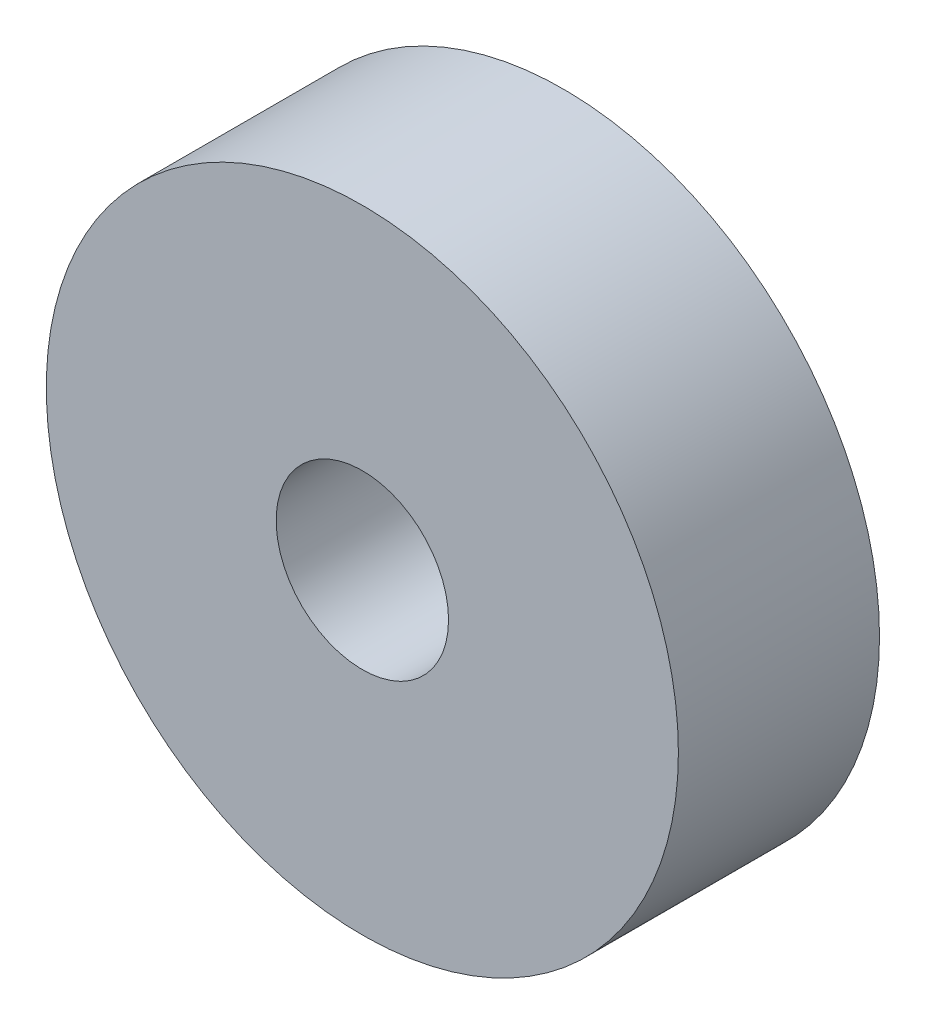
ISO-10303-21;
HEADER;
FILE_DESCRIPTION(('STEP AP214'),'2;1');
FILE_NAME('part.step','',(''),(''),'','','');
FILE_SCHEMA(('AUTOMOTIVE_DESIGN { 1 0 10303 214 1 1 1 1 }'));
ENDSEC;
DATA;
#1=APPLICATION_CONTEXT('core data for automotive mechanical design processes');
#2=APPLICATION_PROTOCOL_DEFINITION('international standard','automotive_design',2000,#1);
#3=PRODUCT_CONTEXT('',#1,'mechanical');
#4=PRODUCT('Part','Part','',(#3));
#5=PRODUCT_RELATED_PRODUCT_CATEGORY('part','',(#4));
#6=PRODUCT_DEFINITION_FORMATION('','',#4);
#7=PRODUCT_DEFINITION_CONTEXT('part definition',#1,'design');
#8=PRODUCT_DEFINITION('design','',#6,#7);
#9=PRODUCT_DEFINITION_SHAPE('','',#8);
#10=(LENGTH_UNIT() NAMED_UNIT(*) SI_UNIT(.MILLI.,.METRE.));
#11=(NAMED_UNIT(*) PLANE_ANGLE_UNIT() SI_UNIT($,.RADIAN.));
#12=(NAMED_UNIT(*) SI_UNIT($,.STERADIAN.) SOLID_ANGLE_UNIT());
#13=UNCERTAINTY_MEASURE_WITH_UNIT(LENGTH_MEASURE(1.E-05),#10,'distance_accuracy_value','');
#14=(GEOMETRIC_REPRESENTATION_CONTEXT(3) GLOBAL_UNCERTAINTY_ASSIGNED_CONTEXT((#13)) GLOBAL_UNIT_ASSIGNED_CONTEXT((#10,
#11,#12)) REPRESENTATION_CONTEXT('',''));
#15=CARTESIAN_POINT('',(0.,0.,0.));
#16=DIRECTION('',(0.,0.,1.));
#17=DIRECTION('',(1.,0.,0.));
#18=AXIS2_PLACEMENT_3D('',#15,#16,#17);
#19=CARTESIAN_POINT('',(0.,0.,7.));
#20=DIRECTION('',(0.,0.,1.));
#21=DIRECTION('',(1.,0.,0.));
#22=AXIS2_PLACEMENT_3D('',#19,#20,#21);
#23=PLANE('',#22);
#24=CARTESIAN_POINT('',(0.,0.,7.));
#25=DIRECTION('',(0.,0.,1.));
#26=DIRECTION('',(1.,0.,0.));
#27=AXIS2_PLACEMENT_3D('',#24,#25,#26);
#28=CIRCLE('',#27,11.);
#29=CARTESIAN_POINT('',(11.,0.,7.));
#30=VERTEX_POINT('',#29);
#31=EDGE_CURVE('E10',#30,#30,#28,.T.);
#32=ORIENTED_EDGE('',*,*,#31,.T.);
#33=EDGE_LOOP('',(#32));
#34=FACE_BOUND('',#33,.T.);
#35=CARTESIAN_POINT('',(0.,0.,7.));
#36=DIRECTION('',(0.,0.,1.));
#37=DIRECTION('',(1.,0.,0.));
#38=AXIS2_PLACEMENT_3D('',#35,#36,#37);
#39=CIRCLE('',#38,3.);
#40=CARTESIAN_POINT('',(3.,0.,7.));
#41=VERTEX_POINT('',#40);
#42=EDGE_CURVE('E44',#41,#41,#39,.T.);
#43=ORIENTED_EDGE('',*,*,#42,.F.);
#44=EDGE_LOOP('',(#43));
#45=FACE_BOUND('',#44,.T.);
#46=ADVANCED_FACE('F33',(#34,#45),#23,.T.);
#47=CARTESIAN_POINT('',(0.,0.,0.));
#48=DIRECTION('',(0.,0.,1.));
#49=DIRECTION('',(1.,0.,0.));
#50=AXIS2_PLACEMENT_3D('',#47,#48,#49);
#51=PLANE('',#50);
#52=CARTESIAN_POINT('',(0.,0.,0.));
#53=DIRECTION('',(0.,0.,1.));
#54=DIRECTION('',(1.,0.,0.));
#55=AXIS2_PLACEMENT_3D('',#52,#53,#54);
#56=CIRCLE('',#55,11.);
#57=CARTESIAN_POINT('',(11.,0.,0.));
#58=VERTEX_POINT('',#57);
#59=EDGE_CURVE('E37',#58,#58,#56,.T.);
#60=ORIENTED_EDGE('',*,*,#59,.F.);
#61=EDGE_LOOP('',(#60));
#62=FACE_BOUND('',#61,.T.);
#63=CARTESIAN_POINT('',(0.,0.,0.));
#64=DIRECTION('',(0.,0.,1.));
#65=DIRECTION('',(1.,0.,0.));
#66=AXIS2_PLACEMENT_3D('',#63,#64,#65);
#67=CIRCLE('',#66,3.);
#68=CARTESIAN_POINT('',(3.,0.,0.));
#69=VERTEX_POINT('',#68);
#70=EDGE_CURVE('E46',#69,#69,#67,.T.);
#71=ORIENTED_EDGE('',*,*,#70,.T.);
#72=EDGE_LOOP('',(#71));
#73=FACE_BOUND('',#72,.T.);
#74=ADVANCED_FACE('F56',(#62,#73),#51,.F.);
#75=CARTESIAN_POINT('',(0.,0.,7.));
#76=DIRECTION('',(0.,0.,-1.));
#77=DIRECTION('',(-1.,0.,0.));
#78=AXIS2_PLACEMENT_3D('',#75,#76,#77);
#79=CYLINDRICAL_SURFACE('',#78,11.);
#80=ORIENTED_EDGE('',*,*,#31,.F.);
#81=EDGE_LOOP('',(#80));
#82=FACE_BOUND('',#81,.T.);
#83=ORIENTED_EDGE('',*,*,#59,.T.);
#84=EDGE_LOOP('',(#83));
#85=FACE_BOUND('',#84,.T.);
#86=ADVANCED_FACE('F35',(#82,#85),#79,.T.);
#87=CARTESIAN_POINT('',(0.,0.,7.));
#88=DIRECTION('',(0.,0.,-1.));
#89=DIRECTION('',(-1.,0.,0.));
#90=AXIS2_PLACEMENT_3D('',#87,#88,#89);
#91=CYLINDRICAL_SURFACE('',#90,3.);
#92=ORIENTED_EDGE('',*,*,#42,.T.);
#93=EDGE_LOOP('',(#92));
#94=FACE_BOUND('',#93,.T.);
#95=ORIENTED_EDGE('',*,*,#70,.F.);
#96=EDGE_LOOP('',(#95));
#97=FACE_BOUND('',#96,.T.);
#98=ADVANCED_FACE('F52',(#94,#97),#91,.F.);
#99=CLOSED_SHELL('',(#46,#74,#86,#98));
#100=MANIFOLD_SOLID_BREP('B2',#99);
#101=ADVANCED_BREP_SHAPE_REPRESENTATION('',(#18,#100),#14);
#102=SHAPE_DEFINITION_REPRESENTATION(#9,#101);
ENDSEC;
END-ISO-10303-21;
